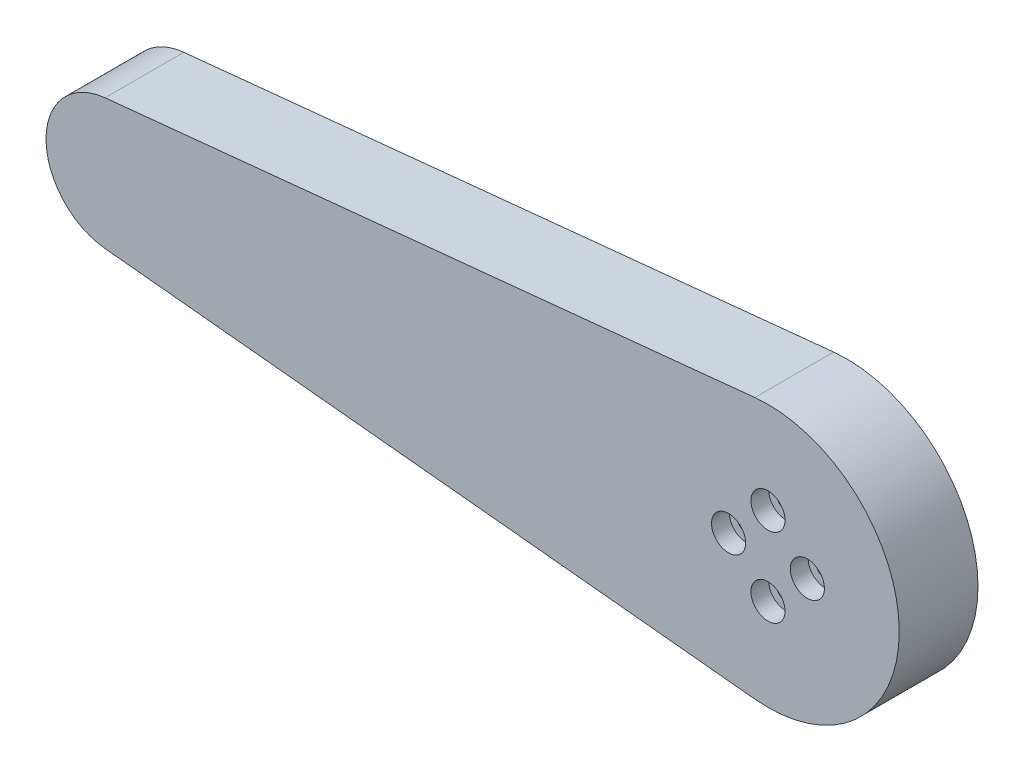
ISO-10303-21;
HEADER;
FILE_DESCRIPTION(('STEP AP214'),'2;1');
FILE_NAME('part.step','',(''),(''),'','','');
FILE_SCHEMA(('AUTOMOTIVE_DESIGN { 1 0 10303 214 1 1 1 1 }'));
ENDSEC;
DATA;
#1=APPLICATION_CONTEXT('core data for automotive mechanical design processes');
#2=APPLICATION_PROTOCOL_DEFINITION('international standard','automotive_design',2000,#1);
#3=PRODUCT_CONTEXT('',#1,'mechanical');
#4=PRODUCT('Part','Part','',(#3));
#5=PRODUCT_RELATED_PRODUCT_CATEGORY('part','',(#4));
#6=PRODUCT_DEFINITION_FORMATION('','',#4);
#7=PRODUCT_DEFINITION_CONTEXT('part definition',#1,'design');
#8=PRODUCT_DEFINITION('design','',#6,#7);
#9=PRODUCT_DEFINITION_SHAPE('','',#8);
#10=(LENGTH_UNIT() NAMED_UNIT(*) SI_UNIT(.MILLI.,.METRE.));
#11=(NAMED_UNIT(*) PLANE_ANGLE_UNIT() SI_UNIT($,.RADIAN.));
#12=(NAMED_UNIT(*) SI_UNIT($,.STERADIAN.) SOLID_ANGLE_UNIT());
#13=UNCERTAINTY_MEASURE_WITH_UNIT(LENGTH_MEASURE(1.E-05),#10,'distance_accuracy_value','');
#14=(GEOMETRIC_REPRESENTATION_CONTEXT(3) GLOBAL_UNCERTAINTY_ASSIGNED_CONTEXT((#13)) GLOBAL_UNIT_ASSIGNED_CONTEXT((#10,
#11,#12)) REPRESENTATION_CONTEXT('',''));
#15=CARTESIAN_POINT('',(0.,0.,0.));
#16=DIRECTION('',(0.,0.,1.));
#17=DIRECTION('',(1.,0.,0.));
#18=AXIS2_PLACEMENT_3D('',#15,#16,#17);
#19=CARTESIAN_POINT('',(-125.,0.,15.));
#20=DIRECTION('',(0.,0.,-1.));
#21=DIRECTION('',(-1.,0.,0.));
#22=AXIS2_PLACEMENT_3D('',#19,#20,#21);
#23=CYLINDRICAL_SURFACE('',#22,12.5);
#24=CARTESIAN_POINT('',(-125.,0.,0.));
#25=DIRECTION('',(0.,0.,1.));
#26=DIRECTION('',(1.,0.,0.));
#27=AXIS2_PLACEMENT_3D('',#24,#25,#26);
#28=CIRCLE('',#27,12.5);
#29=CARTESIAN_POINT('',(-126.25,12.4373429638327,0.));
#30=VERTEX_POINT('',#29);
#31=CARTESIAN_POINT('',(-126.25,-12.4373429638327,0.));
#32=VERTEX_POINT('',#31);
#33=EDGE_CURVE('E105',#30,#32,#28,.T.);
#34=ORIENTED_EDGE('',*,*,#33,.T.);
#35=DIRECTION('',(0.,0.,-1.));
#36=VECTOR('',#35,1.);
#37=CARTESIAN_POINT('',(-126.25,-12.4373429638327,15.));
#38=LINE('',#37,#36);
#39=CARTESIAN_POINT('',(-126.25,-12.4373429638327,15.));
#40=VERTEX_POINT('',#39);
#41=EDGE_CURVE('E11',#40,#32,#38,.T.);
#42=ORIENTED_EDGE('',*,*,#41,.F.);
#43=CARTESIAN_POINT('',(-125.,0.,15.));
#44=DIRECTION('',(0.,0.,1.));
#45=DIRECTION('',(1.,0.,0.));
#46=AXIS2_PLACEMENT_3D('',#43,#44,#45);
#47=CIRCLE('',#46,12.5);
#48=CARTESIAN_POINT('',(-126.25,12.4373429638327,15.));
#49=VERTEX_POINT('',#48);
#50=EDGE_CURVE('E91',#49,#40,#47,.T.);
#51=ORIENTED_EDGE('',*,*,#50,.F.);
#52=DIRECTION('',(0.,0.,-1.));
#53=VECTOR('',#52,1.);
#54=CARTESIAN_POINT('',(-126.25,12.4373429638327,15.));
#55=LINE('',#54,#53);
#56=EDGE_CURVE('E58',#49,#30,#55,.T.);
#57=ORIENTED_EDGE('',*,*,#56,.T.);
#58=EDGE_LOOP('',(#34,#42,#51,#57));
#59=FACE_BOUND('',#58,.T.);
#60=ADVANCED_FACE('F42',(#59),#23,.T.);
#61=CARTESIAN_POINT('',(-126.25,-12.4373429638327,15.));
#62=DIRECTION('',(0.1,0.99498743710662,0.));
#63=DIRECTION('',(-0.99498743710662,0.1,0.));
#64=AXIS2_PLACEMENT_3D('',#61,#62,#63);
#65=PLANE('',#64);
#66=DIRECTION('',(0.99498743710662,-0.1,0.));
#67=VECTOR('',#66,1.);
#68=CARTESIAN_POINT('',(-126.25,-12.4373429638327,0.));
#69=LINE('',#68,#67);
#70=CARTESIAN_POINT('',(-2.5,-24.8746859276655,0.));
#71=VERTEX_POINT('',#70);
#72=EDGE_CURVE('E96',#32,#71,#69,.T.);
#73=ORIENTED_EDGE('',*,*,#72,.T.);
#74=DIRECTION('',(0.,0.,-1.));
#75=VECTOR('',#74,1.);
#76=CARTESIAN_POINT('',(-2.5,-24.8746859276655,15.));
#77=LINE('',#76,#75);
#78=CARTESIAN_POINT('',(-2.5,-24.8746859276655,15.));
#79=VERTEX_POINT('',#78);
#80=EDGE_CURVE('E50',#79,#71,#77,.T.);
#81=ORIENTED_EDGE('',*,*,#80,.F.);
#82=DIRECTION('',(0.99498743710662,-0.1,0.));
#83=VECTOR('',#82,1.);
#84=CARTESIAN_POINT('',(-126.25,-12.4373429638327,15.));
#85=LINE('',#84,#83);
#86=EDGE_CURVE('E84',#40,#79,#85,.T.);
#87=ORIENTED_EDGE('',*,*,#86,.F.);
#88=ORIENTED_EDGE('',*,*,#41,.T.);
#89=EDGE_LOOP('',(#73,#81,#87,#88));
#90=FACE_BOUND('',#89,.T.);
#91=ADVANCED_FACE('F95',(#90),#65,.F.);
#92=CARTESIAN_POINT('',(0.,0.,15.));
#93=DIRECTION('',(0.,0.,-1.));
#94=DIRECTION('',(-1.,0.,0.));
#95=AXIS2_PLACEMENT_3D('',#92,#93,#94);
#96=CYLINDRICAL_SURFACE('',#95,25.);
#97=CARTESIAN_POINT('',(0.,0.,0.));
#98=DIRECTION('',(0.,0.,1.));
#99=DIRECTION('',(1.,0.,0.));
#100=AXIS2_PLACEMENT_3D('',#97,#98,#99);
#101=CIRCLE('',#100,25.);
#102=CARTESIAN_POINT('',(-2.5,24.8746859276655,0.));
#103=VERTEX_POINT('',#102);
#104=EDGE_CURVE('E109',#71,#103,#101,.T.);
#105=ORIENTED_EDGE('',*,*,#104,.T.);
#106=DIRECTION('',(0.,0.,-1.));
#107=VECTOR('',#106,1.);
#108=CARTESIAN_POINT('',(-2.5,24.8746859276655,15.));
#109=LINE('',#108,#107);
#110=CARTESIAN_POINT('',(-2.5,24.8746859276655,15.));
#111=VERTEX_POINT('',#110);
#112=EDGE_CURVE('E73',#111,#103,#109,.T.);
#113=ORIENTED_EDGE('',*,*,#112,.F.);
#114=CARTESIAN_POINT('',(0.,0.,15.));
#115=DIRECTION('',(0.,0.,1.));
#116=DIRECTION('',(1.,0.,0.));
#117=AXIS2_PLACEMENT_3D('',#114,#115,#116);
#118=CIRCLE('',#117,25.);
#119=EDGE_CURVE('E90',#79,#111,#118,.T.);
#120=ORIENTED_EDGE('',*,*,#119,.F.);
#121=ORIENTED_EDGE('',*,*,#80,.T.);
#122=EDGE_LOOP('',(#105,#113,#120,#121));
#123=FACE_BOUND('',#122,.T.);
#124=ADVANCED_FACE('F99',(#123),#96,.T.);
#125=CARTESIAN_POINT('',(-126.25,12.4373429638327,15.));
#126=DIRECTION('',(-0.1,0.99498743710662,0.));
#127=DIRECTION('',(-0.99498743710662,-0.1,0.));
#128=AXIS2_PLACEMENT_3D('',#125,#126,#127);
#129=PLANE('',#128);
#130=DIRECTION('',(0.99498743710662,0.1,0.));
#131=VECTOR('',#130,1.);
#132=CARTESIAN_POINT('',(-126.25,12.4373429638327,0.));
#133=LINE('',#132,#131);
#134=EDGE_CURVE('E111',#30,#103,#133,.T.);
#135=ORIENTED_EDGE('',*,*,#134,.F.);
#136=ORIENTED_EDGE('',*,*,#56,.F.);
#137=DIRECTION('',(0.99498743710662,0.1,0.));
#138=VECTOR('',#137,1.);
#139=CARTESIAN_POINT('',(-126.25,12.4373429638327,15.));
#140=LINE('',#139,#138);
#141=EDGE_CURVE('E100',#49,#111,#140,.T.);
#142=ORIENTED_EDGE('',*,*,#141,.T.);
#143=ORIENTED_EDGE('',*,*,#112,.T.);
#144=EDGE_LOOP('',(#135,#136,#142,#143));
#145=FACE_BOUND('',#144,.T.);
#146=ADVANCED_FACE('F170',(#145),#129,.T.);
#147=CARTESIAN_POINT('',(-125.,0.,15.));
#148=DIRECTION('',(0.,0.,1.));
#149=DIRECTION('',(1.,0.,0.));
#150=AXIS2_PLACEMENT_3D('',#147,#148,#149);
#151=PLANE('',#150);
#152=CARTESIAN_POINT('',(0.,7.5,15.));
#153=DIRECTION('',(0.,0.,1.));
#154=DIRECTION('',(1.,0.,0.));
#155=AXIS2_PLACEMENT_3D('',#152,#153,#154);
#156=CIRCLE('',#155,3.25);
#157=CARTESIAN_POINT('',(3.25,7.5,15.));
#158=VERTEX_POINT('',#157);
#159=EDGE_CURVE('E161',#158,#158,#156,.T.);
#160=ORIENTED_EDGE('',*,*,#159,.F.);
#161=EDGE_LOOP('',(#160));
#162=FACE_BOUND('',#161,.T.);
#163=CARTESIAN_POINT('',(7.5,0.,15.));
#164=DIRECTION('',(0.,0.,1.));
#165=DIRECTION('',(1.,0.,0.));
#166=AXIS2_PLACEMENT_3D('',#163,#164,#165);
#167=CIRCLE('',#166,3.25);
#168=CARTESIAN_POINT('',(10.75,0.,15.));
#169=VERTEX_POINT('',#168);
#170=EDGE_CURVE('E149',#169,#169,#167,.T.);
#171=ORIENTED_EDGE('',*,*,#170,.F.);
#172=EDGE_LOOP('',(#171));
#173=FACE_BOUND('',#172,.T.);
#174=CARTESIAN_POINT('',(0.,-7.5,15.));
#175=DIRECTION('',(0.,0.,1.));
#176=DIRECTION('',(1.,0.,0.));
#177=AXIS2_PLACEMENT_3D('',#174,#175,#176);
#178=CIRCLE('',#177,3.25);
#179=CARTESIAN_POINT('',(3.25,-7.5,15.));
#180=VERTEX_POINT('',#179);
#181=EDGE_CURVE('E137',#180,#180,#178,.T.);
#182=ORIENTED_EDGE('',*,*,#181,.F.);
#183=EDGE_LOOP('',(#182));
#184=FACE_BOUND('',#183,.T.);
#185=CARTESIAN_POINT('',(-7.5,0.,15.));
#186=DIRECTION('',(0.,0.,1.));
#187=DIRECTION('',(1.,0.,0.));
#188=AXIS2_PLACEMENT_3D('',#185,#186,#187);
#189=CIRCLE('',#188,3.25);
#190=CARTESIAN_POINT('',(-4.25,0.,15.));
#191=VERTEX_POINT('',#190);
#192=EDGE_CURVE('E125',#191,#191,#189,.T.);
#193=ORIENTED_EDGE('',*,*,#192,.F.);
#194=EDGE_LOOP('',(#193));
#195=FACE_BOUND('',#194,.T.);
#196=ORIENTED_EDGE('',*,*,#50,.T.);
#197=ORIENTED_EDGE('',*,*,#86,.T.);
#198=ORIENTED_EDGE('',*,*,#119,.T.);
#199=ORIENTED_EDGE('',*,*,#141,.F.);
#200=EDGE_LOOP('',(#196,#197,#198,#199));
#201=FACE_BOUND('',#200,.T.);
#202=ADVANCED_FACE('F87',(#162,#173,#184,#195,#201),#151,.T.);
#203=CARTESIAN_POINT('',(-125.,0.,0.));
#204=DIRECTION('',(0.,0.,1.));
#205=DIRECTION('',(1.,0.,0.));
#206=AXIS2_PLACEMENT_3D('',#203,#204,#205);
#207=PLANE('',#206);
#208=CARTESIAN_POINT('',(0.,7.5,0.));
#209=DIRECTION('',(0.,0.,1.));
#210=DIRECTION('',(1.,0.,0.));
#211=AXIS2_PLACEMENT_3D('',#208,#209,#210);
#212=CIRCLE('',#211,1.7);
#213=CARTESIAN_POINT('',(1.7,7.5,0.));
#214=VERTEX_POINT('',#213);
#215=EDGE_CURVE('E152',#214,#214,#212,.T.);
#216=ORIENTED_EDGE('',*,*,#215,.T.);
#217=EDGE_LOOP('',(#216));
#218=FACE_BOUND('',#217,.T.);
#219=CARTESIAN_POINT('',(7.5,0.,0.));
#220=DIRECTION('',(0.,0.,1.));
#221=DIRECTION('',(1.,0.,0.));
#222=AXIS2_PLACEMENT_3D('',#219,#220,#221);
#223=CIRCLE('',#222,1.7);
#224=CARTESIAN_POINT('',(9.2,0.,0.));
#225=VERTEX_POINT('',#224);
#226=EDGE_CURVE('E140',#225,#225,#223,.T.);
#227=ORIENTED_EDGE('',*,*,#226,.T.);
#228=EDGE_LOOP('',(#227));
#229=FACE_BOUND('',#228,.T.);
#230=CARTESIAN_POINT('',(0.,-7.5,0.));
#231=DIRECTION('',(0.,0.,1.));
#232=DIRECTION('',(1.,0.,0.));
#233=AXIS2_PLACEMENT_3D('',#230,#231,#232);
#234=CIRCLE('',#233,1.7);
#235=CARTESIAN_POINT('',(1.7,-7.5,0.));
#236=VERTEX_POINT('',#235);
#237=EDGE_CURVE('E128',#236,#236,#234,.T.);
#238=ORIENTED_EDGE('',*,*,#237,.T.);
#239=EDGE_LOOP('',(#238));
#240=FACE_BOUND('',#239,.T.);
#241=CARTESIAN_POINT('',(-7.5,0.,0.));
#242=DIRECTION('',(0.,0.,1.));
#243=DIRECTION('',(1.,0.,0.));
#244=AXIS2_PLACEMENT_3D('',#241,#242,#243);
#245=CIRCLE('',#244,1.7);
#246=CARTESIAN_POINT('',(-5.8,0.,0.));
#247=VERTEX_POINT('',#246);
#248=EDGE_CURVE('E107',#247,#247,#245,.T.);
#249=ORIENTED_EDGE('',*,*,#248,.T.);
#250=EDGE_LOOP('',(#249));
#251=FACE_BOUND('',#250,.T.);
#252=ORIENTED_EDGE('',*,*,#33,.F.);
#253=ORIENTED_EDGE('',*,*,#134,.T.);
#254=ORIENTED_EDGE('',*,*,#104,.F.);
#255=ORIENTED_EDGE('',*,*,#72,.F.);
#256=EDGE_LOOP('',(#252,#253,#254,#255));
#257=FACE_BOUND('',#256,.T.);
#258=ADVANCED_FACE('F169',(#218,#229,#240,#251,#257),#207,.F.);
#259=CARTESIAN_POINT('',(-7.5,0.,15.));
#260=DIRECTION('',(0.,0.,1.));
#261=DIRECTION('',(1.,0.,0.));
#262=AXIS2_PLACEMENT_3D('',#259,#260,#261);
#263=CYLINDRICAL_SURFACE('',#262,1.7);
#264=ORIENTED_EDGE('',*,*,#248,.F.);
#265=EDGE_LOOP('',(#264));
#266=FACE_BOUND('',#265,.T.);
#267=CARTESIAN_POINT('',(-7.5,0.,11.6));
#268=DIRECTION('',(0.,0.,1.));
#269=DIRECTION('',(1.,0.,0.));
#270=AXIS2_PLACEMENT_3D('',#267,#268,#269);
#271=CIRCLE('',#270,1.7);
#272=CARTESIAN_POINT('',(-5.8,0.,11.6));
#273=VERTEX_POINT('',#272);
#274=EDGE_CURVE('E119',#273,#273,#271,.T.);
#275=ORIENTED_EDGE('',*,*,#274,.T.);
#276=EDGE_LOOP('',(#275));
#277=FACE_BOUND('',#276,.T.);
#278=ADVANCED_FACE('F191',(#266,#277),#263,.F.);
#279=CARTESIAN_POINT('',(-5.8,0.,11.6));
#280=DIRECTION('',(0.,0.,-1.));
#281=DIRECTION('',(-1.,0.,0.));
#282=AXIS2_PLACEMENT_3D('',#279,#280,#281);
#283=PLANE('',#282);
#284=ORIENTED_EDGE('',*,*,#274,.F.);
#285=EDGE_LOOP('',(#284));
#286=FACE_BOUND('',#285,.T.);
#287=CARTESIAN_POINT('',(-7.5,0.,11.6));
#288=DIRECTION('',(0.,0.,1.));
#289=DIRECTION('',(1.,0.,0.));
#290=AXIS2_PLACEMENT_3D('',#287,#288,#289);
#291=CIRCLE('',#290,3.25);
#292=CARTESIAN_POINT('',(-4.25,0.,11.6));
#293=VERTEX_POINT('',#292);
#294=EDGE_CURVE('E122',#293,#293,#291,.T.);
#295=ORIENTED_EDGE('',*,*,#294,.T.);
#296=EDGE_LOOP('',(#295));
#297=FACE_BOUND('',#296,.T.);
#298=ADVANCED_FACE('F181',(#286,#297),#283,.F.);
#299=CARTESIAN_POINT('',(-7.5,0.,15.));
#300=DIRECTION('',(0.,0.,1.));
#301=DIRECTION('',(1.,0.,0.));
#302=AXIS2_PLACEMENT_3D('',#299,#300,#301);
#303=CYLINDRICAL_SURFACE('',#302,3.25);
#304=ORIENTED_EDGE('',*,*,#294,.F.);
#305=EDGE_LOOP('',(#304));
#306=FACE_BOUND('',#305,.T.);
#307=ORIENTED_EDGE('',*,*,#192,.T.);
#308=EDGE_LOOP('',(#307));
#309=FACE_BOUND('',#308,.T.);
#310=ADVANCED_FACE('F178',(#306,#309),#303,.F.);
#311=CARTESIAN_POINT('',(0.,-7.5,15.));
#312=DIRECTION('',(0.,0.,1.));
#313=DIRECTION('',(1.,0.,0.));
#314=AXIS2_PLACEMENT_3D('',#311,#312,#313);
#315=CYLINDRICAL_SURFACE('',#314,1.7);
#316=ORIENTED_EDGE('',*,*,#237,.F.);
#317=EDGE_LOOP('',(#316));
#318=FACE_BOUND('',#317,.T.);
#319=CARTESIAN_POINT('',(0.,-7.5,11.6));
#320=DIRECTION('',(0.,0.,1.));
#321=DIRECTION('',(1.,0.,0.));
#322=AXIS2_PLACEMENT_3D('',#319,#320,#321);
#323=CIRCLE('',#322,1.7);
#324=CARTESIAN_POINT('',(1.7,-7.5,11.6));
#325=VERTEX_POINT('',#324);
#326=EDGE_CURVE('E131',#325,#325,#323,.T.);
#327=ORIENTED_EDGE('',*,*,#326,.T.);
#328=EDGE_LOOP('',(#327));
#329=FACE_BOUND('',#328,.T.);
#330=ADVANCED_FACE('F180',(#318,#329),#315,.F.);
#331=CARTESIAN_POINT('',(1.7,-7.5,11.6));
#332=DIRECTION('',(0.,0.,-1.));
#333=DIRECTION('',(-1.,0.,0.));
#334=AXIS2_PLACEMENT_3D('',#331,#332,#333);
#335=PLANE('',#334);
#336=ORIENTED_EDGE('',*,*,#326,.F.);
#337=EDGE_LOOP('',(#336));
#338=FACE_BOUND('',#337,.T.);
#339=CARTESIAN_POINT('',(0.,-7.5,11.6));
#340=DIRECTION('',(0.,0.,1.));
#341=DIRECTION('',(1.,0.,0.));
#342=AXIS2_PLACEMENT_3D('',#339,#340,#341);
#343=CIRCLE('',#342,3.25);
#344=CARTESIAN_POINT('',(3.25,-7.5,11.6));
#345=VERTEX_POINT('',#344);
#346=EDGE_CURVE('E134',#345,#345,#343,.T.);
#347=ORIENTED_EDGE('',*,*,#346,.T.);
#348=EDGE_LOOP('',(#347));
#349=FACE_BOUND('',#348,.T.);
#350=ADVANCED_FACE('F188',(#338,#349),#335,.F.);
#351=CARTESIAN_POINT('',(0.,-7.5,15.));
#352=DIRECTION('',(0.,0.,1.));
#353=DIRECTION('',(1.,0.,0.));
#354=AXIS2_PLACEMENT_3D('',#351,#352,#353);
#355=CYLINDRICAL_SURFACE('',#354,3.25);
#356=ORIENTED_EDGE('',*,*,#346,.F.);
#357=EDGE_LOOP('',(#356));
#358=FACE_BOUND('',#357,.T.);
#359=ORIENTED_EDGE('',*,*,#181,.T.);
#360=EDGE_LOOP('',(#359));
#361=FACE_BOUND('',#360,.T.);
#362=ADVANCED_FACE('F245',(#358,#361),#355,.F.);
#363=CARTESIAN_POINT('',(7.5,0.,15.));
#364=DIRECTION('',(0.,0.,1.));
#365=DIRECTION('',(1.,0.,0.));
#366=AXIS2_PLACEMENT_3D('',#363,#364,#365);
#367=CYLINDRICAL_SURFACE('',#366,1.7);
#368=ORIENTED_EDGE('',*,*,#226,.F.);
#369=EDGE_LOOP('',(#368));
#370=FACE_BOUND('',#369,.T.);
#371=CARTESIAN_POINT('',(7.5,0.,11.6));
#372=DIRECTION('',(0.,0.,1.));
#373=DIRECTION('',(1.,0.,0.));
#374=AXIS2_PLACEMENT_3D('',#371,#372,#373);
#375=CIRCLE('',#374,1.7);
#376=CARTESIAN_POINT('',(9.2,0.,11.6));
#377=VERTEX_POINT('',#376);
#378=EDGE_CURVE('E143',#377,#377,#375,.T.);
#379=ORIENTED_EDGE('',*,*,#378,.T.);
#380=EDGE_LOOP('',(#379));
#381=FACE_BOUND('',#380,.T.);
#382=ADVANCED_FACE('F255',(#370,#381),#367,.F.);
#383=CARTESIAN_POINT('',(9.2,0.,11.6));
#384=DIRECTION('',(0.,0.,-1.));
#385=DIRECTION('',(-1.,0.,0.));
#386=AXIS2_PLACEMENT_3D('',#383,#384,#385);
#387=PLANE('',#386);
#388=ORIENTED_EDGE('',*,*,#378,.F.);
#389=EDGE_LOOP('',(#388));
#390=FACE_BOUND('',#389,.T.);
#391=CARTESIAN_POINT('',(7.5,0.,11.6));
#392=DIRECTION('',(0.,0.,1.));
#393=DIRECTION('',(1.,0.,0.));
#394=AXIS2_PLACEMENT_3D('',#391,#392,#393);
#395=CIRCLE('',#394,3.25);
#396=CARTESIAN_POINT('',(10.75,0.,11.6));
#397=VERTEX_POINT('',#396);
#398=EDGE_CURVE('E146',#397,#397,#395,.T.);
#399=ORIENTED_EDGE('',*,*,#398,.T.);
#400=EDGE_LOOP('',(#399));
#401=FACE_BOUND('',#400,.T.);
#402=ADVANCED_FACE('F265',(#390,#401),#387,.F.);
#403=CARTESIAN_POINT('',(7.5,0.,15.));
#404=DIRECTION('',(0.,0.,1.));
#405=DIRECTION('',(1.,0.,0.));
#406=AXIS2_PLACEMENT_3D('',#403,#404,#405);
#407=CYLINDRICAL_SURFACE('',#406,3.25);
#408=ORIENTED_EDGE('',*,*,#398,.F.);
#409=EDGE_LOOP('',(#408));
#410=FACE_BOUND('',#409,.T.);
#411=ORIENTED_EDGE('',*,*,#170,.T.);
#412=EDGE_LOOP('',(#411));
#413=FACE_BOUND('',#412,.T.);
#414=ADVANCED_FACE('F275',(#410,#413),#407,.F.);
#415=CARTESIAN_POINT('',(0.,7.5,15.));
#416=DIRECTION('',(0.,0.,1.));
#417=DIRECTION('',(1.,0.,0.));
#418=AXIS2_PLACEMENT_3D('',#415,#416,#417);
#419=CYLINDRICAL_SURFACE('',#418,1.7);
#420=ORIENTED_EDGE('',*,*,#215,.F.);
#421=EDGE_LOOP('',(#420));
#422=FACE_BOUND('',#421,.T.);
#423=CARTESIAN_POINT('',(0.,7.5,11.6));
#424=DIRECTION('',(0.,0.,1.));
#425=DIRECTION('',(1.,0.,0.));
#426=AXIS2_PLACEMENT_3D('',#423,#424,#425);
#427=CIRCLE('',#426,1.7);
#428=CARTESIAN_POINT('',(1.7,7.5,11.6));
#429=VERTEX_POINT('',#428);
#430=EDGE_CURVE('E155',#429,#429,#427,.T.);
#431=ORIENTED_EDGE('',*,*,#430,.T.);
#432=EDGE_LOOP('',(#431));
#433=FACE_BOUND('',#432,.T.);
#434=ADVANCED_FACE('F285',(#422,#433),#419,.F.);
#435=CARTESIAN_POINT('',(1.7,7.5,11.6));
#436=DIRECTION('',(0.,0.,-1.));
#437=DIRECTION('',(-1.,0.,0.));
#438=AXIS2_PLACEMENT_3D('',#435,#436,#437);
#439=PLANE('',#438);
#440=ORIENTED_EDGE('',*,*,#430,.F.);
#441=EDGE_LOOP('',(#440));
#442=FACE_BOUND('',#441,.T.);
#443=CARTESIAN_POINT('',(0.,7.5,11.6));
#444=DIRECTION('',(0.,0.,1.));
#445=DIRECTION('',(1.,0.,0.));
#446=AXIS2_PLACEMENT_3D('',#443,#444,#445);
#447=CIRCLE('',#446,3.25);
#448=CARTESIAN_POINT('',(3.25,7.5,11.6));
#449=VERTEX_POINT('',#448);
#450=EDGE_CURVE('E158',#449,#449,#447,.T.);
#451=ORIENTED_EDGE('',*,*,#450,.T.);
#452=EDGE_LOOP('',(#451));
#453=FACE_BOUND('',#452,.T.);
#454=ADVANCED_FACE('F295',(#442,#453),#439,.F.);
#455=CARTESIAN_POINT('',(0.,7.5,15.));
#456=DIRECTION('',(0.,0.,1.));
#457=DIRECTION('',(1.,0.,0.));
#458=AXIS2_PLACEMENT_3D('',#455,#456,#457);
#459=CYLINDRICAL_SURFACE('',#458,3.25);
#460=ORIENTED_EDGE('',*,*,#450,.F.);
#461=EDGE_LOOP('',(#460));
#462=FACE_BOUND('',#461,.T.);
#463=ORIENTED_EDGE('',*,*,#159,.T.);
#464=EDGE_LOOP('',(#463));
#465=FACE_BOUND('',#464,.T.);
#466=ADVANCED_FACE('F165',(#462,#465),#459,.F.);
#467=CLOSED_SHELL('',(#60,#91,#124,#146,#202,#258,#278,#298,#310,#330,#350,#362,#382,#402,#414,
#434,#454,#466));
#468=MANIFOLD_SOLID_BREP('B2',#467);
#469=ADVANCED_BREP_SHAPE_REPRESENTATION('',(#18,#468),#14);
#470=SHAPE_DEFINITION_REPRESENTATION(#9,#469);
ENDSEC;
END-ISO-10303-21;
